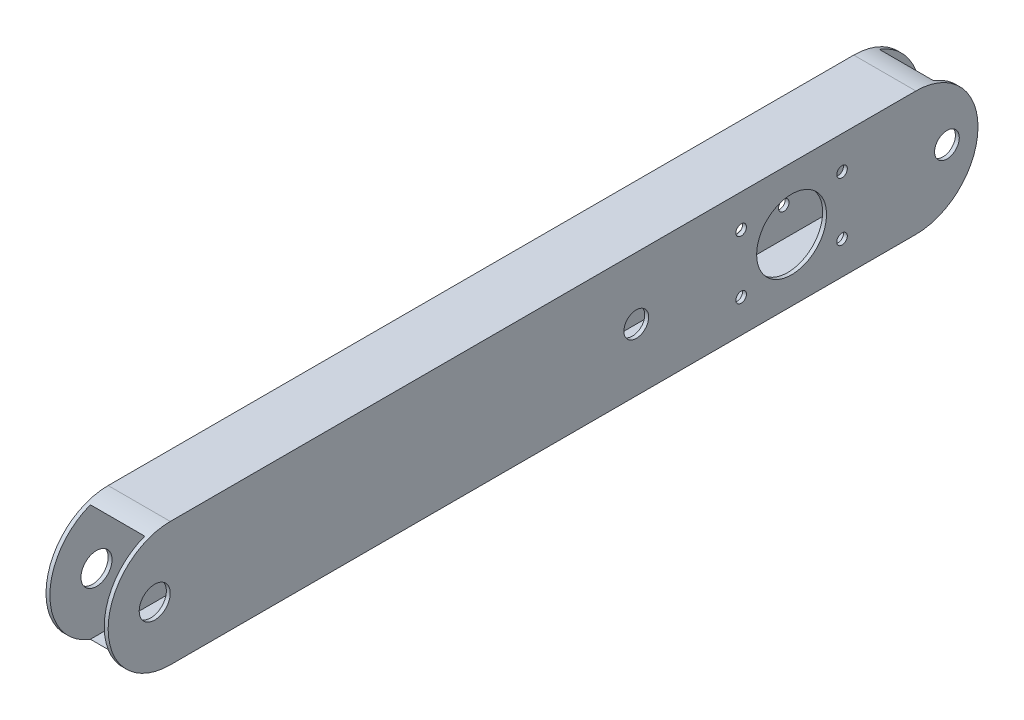
ISO-10303-21;
HEADER;
FILE_DESCRIPTION(('STEP AP214'),'2;1');
FILE_NAME('part.step','',(''),(''),'','','');
FILE_SCHEMA(('AUTOMOTIVE_DESIGN { 1 0 10303 214 1 1 1 1 }'));
ENDSEC;
DATA;
#1=APPLICATION_CONTEXT('core data for automotive mechanical design processes');
#2=APPLICATION_PROTOCOL_DEFINITION('international standard','automotive_design',2000,#1);
#3=PRODUCT_CONTEXT('',#1,'mechanical');
#4=PRODUCT('Part','Part','',(#3));
#5=PRODUCT_RELATED_PRODUCT_CATEGORY('part','',(#4));
#6=PRODUCT_DEFINITION_FORMATION('','',#4);
#7=PRODUCT_DEFINITION_CONTEXT('part definition',#1,'design');
#8=PRODUCT_DEFINITION('design','',#6,#7);
#9=PRODUCT_DEFINITION_SHAPE('','',#8);
#10=(LENGTH_UNIT() NAMED_UNIT(*) SI_UNIT(.MILLI.,.METRE.));
#11=(NAMED_UNIT(*) PLANE_ANGLE_UNIT() SI_UNIT($,.RADIAN.));
#12=(NAMED_UNIT(*) SI_UNIT($,.STERADIAN.) SOLID_ANGLE_UNIT());
#13=UNCERTAINTY_MEASURE_WITH_UNIT(LENGTH_MEASURE(1.E-05),#10,'distance_accuracy_value','');
#14=(GEOMETRIC_REPRESENTATION_CONTEXT(3) GLOBAL_UNCERTAINTY_ASSIGNED_CONTEXT((#13)) GLOBAL_UNIT_ASSIGNED_CONTEXT((#10,
#11,#12)) REPRESENTATION_CONTEXT('',''));
#15=CARTESIAN_POINT('',(0.,0.,0.));
#16=DIRECTION('',(0.,0.,1.));
#17=DIRECTION('',(1.,0.,0.));
#18=AXIS2_PLACEMENT_3D('',#15,#16,#17);
#19=CARTESIAN_POINT('',(-12.7,0.,158.75));
#20=DIRECTION('',(-1.,0.,0.));
#21=DIRECTION('',(0.,0.,1.));
#22=AXIS2_PLACEMENT_3D('',#19,#20,#21);
#23=CYLINDRICAL_SURFACE('',#22,6.35);
#24=CARTESIAN_POINT('',(11.1125,0.,158.75));
#25=DIRECTION('',(-1.,0.,0.));
#26=DIRECTION('',(0.,0.,1.));
#27=AXIS2_PLACEMENT_3D('',#24,#25,#26);
#28=CIRCLE('',#27,6.35);
#29=CARTESIAN_POINT('',(11.1125,0.,165.1));
#30=VERTEX_POINT('',#29);
#31=EDGE_CURVE('E115',#30,#30,#28,.F.);
#32=ORIENTED_EDGE('',*,*,#31,.F.);
#33=EDGE_LOOP('',(#32));
#34=FACE_BOUND('',#33,.T.);
#35=CARTESIAN_POINT('',(12.7,0.,158.75));
#36=DIRECTION('',(-1.,0.,0.));
#37=DIRECTION('',(0.,0.,1.));
#38=AXIS2_PLACEMENT_3D('',#35,#36,#37);
#39=CIRCLE('',#38,6.35);
#40=CARTESIAN_POINT('',(12.7,0.,165.1));
#41=VERTEX_POINT('',#40);
#42=EDGE_CURVE('E19',#41,#41,#39,.T.);
#43=ORIENTED_EDGE('',*,*,#42,.F.);
#44=EDGE_LOOP('',(#43));
#45=FACE_BOUND('',#44,.T.);
#46=ADVANCED_FACE('F16',(#34,#45),#23,.F.);
#47=CARTESIAN_POINT('',(12.7,0.,-38.1));
#48=DIRECTION('',(1.,0.,0.));
#49=DIRECTION('',(0.,0.,-1.));
#50=AXIS2_PLACEMENT_3D('',#47,#48,#49);
#51=CYLINDRICAL_SURFACE('',#50,5.0546);
#52=CARTESIAN_POINT('',(11.1125,0.,-38.1));
#53=DIRECTION('',(1.,0.,0.));
#54=DIRECTION('',(0.,0.,-1.));
#55=AXIS2_PLACEMENT_3D('',#52,#53,#54);
#56=CIRCLE('',#55,5.0546);
#57=CARTESIAN_POINT('',(11.1125,0.,-43.1546));
#58=VERTEX_POINT('',#57);
#59=EDGE_CURVE('E213',#58,#58,#56,.T.);
#60=ORIENTED_EDGE('',*,*,#59,.F.);
#61=EDGE_LOOP('',(#60));
#62=FACE_BOUND('',#61,.T.);
#63=CARTESIAN_POINT('',(12.7,0.,-38.1));
#64=DIRECTION('',(1.,0.,0.));
#65=DIRECTION('',(0.,0.,-1.));
#66=AXIS2_PLACEMENT_3D('',#63,#64,#65);
#67=CIRCLE('',#66,5.0546);
#68=CARTESIAN_POINT('',(12.7,0.,-43.1546));
#69=VERTEX_POINT('',#68);
#70=EDGE_CURVE('E234',#69,#69,#67,.F.);
#71=ORIENTED_EDGE('',*,*,#70,.F.);
#72=EDGE_LOOP('',(#71));
#73=FACE_BOUND('',#72,.T.);
#74=ADVANCED_FACE('F243',(#62,#73),#51,.F.);
#75=CARTESIAN_POINT('',(12.7,0.,-165.1));
#76=DIRECTION('',(1.,0.,0.));
#77=DIRECTION('',(0.,0.,-1.));
#78=AXIS2_PLACEMENT_3D('',#75,#76,#77);
#79=CYLINDRICAL_SURFACE('',#78,5.0546);
#80=CARTESIAN_POINT('',(11.1125,0.,-165.1));
#81=DIRECTION('',(1.,0.,0.));
#82=DIRECTION('',(0.,0.,-1.));
#83=AXIS2_PLACEMENT_3D('',#80,#81,#82);
#84=CIRCLE('',#83,5.0546);
#85=CARTESIAN_POINT('',(11.1125,0.,-170.1546));
#86=VERTEX_POINT('',#85);
#87=EDGE_CURVE('E210',#86,#86,#84,.T.);
#88=ORIENTED_EDGE('',*,*,#87,.F.);
#89=EDGE_LOOP('',(#88));
#90=FACE_BOUND('',#89,.T.);
#91=CARTESIAN_POINT('',(12.7,0.,-165.1));
#92=DIRECTION('',(1.,0.,0.));
#93=DIRECTION('',(0.,0.,-1.));
#94=AXIS2_PLACEMENT_3D('',#91,#92,#93);
#95=CIRCLE('',#94,5.0546);
#96=CARTESIAN_POINT('',(12.7,0.,-170.1546));
#97=VERTEX_POINT('',#96);
#98=EDGE_CURVE('E232',#97,#97,#95,.F.);
#99=ORIENTED_EDGE('',*,*,#98,.F.);
#100=EDGE_LOOP('',(#99));
#101=FACE_BOUND('',#100,.T.);
#102=ADVANCED_FACE('F249',(#90,#101),#79,.F.);
#103=CARTESIAN_POINT('',(12.7,-11.90625,-80.9777700723808));
#104=DIRECTION('',(1.,0.,0.));
#105=DIRECTION('',(0.,0.,-1.));
#106=AXIS2_PLACEMENT_3D('',#103,#104,#105);
#107=CYLINDRICAL_SURFACE('',#106,2.159);
#108=CARTESIAN_POINT('',(11.1125,-11.90625,-80.9777700723808));
#109=DIRECTION('',(1.,0.,0.));
#110=DIRECTION('',(0.,0.,-1.));
#111=AXIS2_PLACEMENT_3D('',#108,#109,#110);
#112=CIRCLE('',#111,2.159);
#113=CARTESIAN_POINT('',(11.1125,-11.90625,-83.1367700723808));
#114=VERTEX_POINT('',#113);
#115=EDGE_CURVE('E207',#114,#114,#112,.T.);
#116=ORIENTED_EDGE('',*,*,#115,.F.);
#117=EDGE_LOOP('',(#116));
#118=FACE_BOUND('',#117,.T.);
#119=CARTESIAN_POINT('',(12.7,-11.90625,-80.9777700723808));
#120=DIRECTION('',(1.,0.,0.));
#121=DIRECTION('',(0.,0.,-1.));
#122=AXIS2_PLACEMENT_3D('',#119,#120,#121);
#123=CIRCLE('',#122,2.159);
#124=CARTESIAN_POINT('',(12.7,-11.90625,-83.1367700723808));
#125=VERTEX_POINT('',#124);
#126=EDGE_CURVE('E229',#125,#125,#123,.F.);
#127=ORIENTED_EDGE('',*,*,#126,.F.);
#128=EDGE_LOOP('',(#127));
#129=FACE_BOUND('',#128,.T.);
#130=ADVANCED_FACE('F338',(#118,#129),#107,.F.);
#131=CARTESIAN_POINT('',(12.7,11.90625,-80.9777700723808));
#132=DIRECTION('',(1.,0.,0.));
#133=DIRECTION('',(0.,0.,-1.));
#134=AXIS2_PLACEMENT_3D('',#131,#132,#133);
#135=CYLINDRICAL_SURFACE('',#134,2.159);
#136=CARTESIAN_POINT('',(11.1125,11.90625,-80.9777700723808));
#137=DIRECTION('',(1.,0.,0.));
#138=DIRECTION('',(0.,0.,-1.));
#139=AXIS2_PLACEMENT_3D('',#136,#137,#138);
#140=CIRCLE('',#139,2.159);
#141=CARTESIAN_POINT('',(11.1125,11.90625,-83.1367700723808));
#142=VERTEX_POINT('',#141);
#143=EDGE_CURVE('E204',#142,#142,#140,.T.);
#144=ORIENTED_EDGE('',*,*,#143,.F.);
#145=EDGE_LOOP('',(#144));
#146=FACE_BOUND('',#145,.T.);
#147=CARTESIAN_POINT('',(12.7,11.90625,-80.9777700723808));
#148=DIRECTION('',(1.,0.,0.));
#149=DIRECTION('',(0.,0.,-1.));
#150=AXIS2_PLACEMENT_3D('',#147,#148,#149);
#151=CIRCLE('',#150,2.159);
#152=CARTESIAN_POINT('',(12.7,11.90625,-83.1367700723808));
#153=VERTEX_POINT('',#152);
#154=EDGE_CURVE('E226',#153,#153,#151,.F.);
#155=ORIENTED_EDGE('',*,*,#154,.F.);
#156=EDGE_LOOP('',(#155));
#157=FACE_BOUND('',#156,.T.);
#158=ADVANCED_FACE('F334',(#146,#157),#135,.F.);
#159=CARTESIAN_POINT('',(12.7,11.90625,-122.222229927619));
#160=DIRECTION('',(1.,0.,0.));
#161=DIRECTION('',(0.,0.,-1.));
#162=AXIS2_PLACEMENT_3D('',#159,#160,#161);
#163=CYLINDRICAL_SURFACE('',#162,2.159);
#164=CARTESIAN_POINT('',(11.1125,11.90625,-122.222229927619));
#165=DIRECTION('',(1.,0.,0.));
#166=DIRECTION('',(0.,0.,-1.));
#167=AXIS2_PLACEMENT_3D('',#164,#165,#166);
#168=CIRCLE('',#167,2.159);
#169=CARTESIAN_POINT('',(11.1125,11.90625,-124.381229927619));
#170=VERTEX_POINT('',#169);
#171=EDGE_CURVE('E201',#170,#170,#168,.T.);
#172=ORIENTED_EDGE('',*,*,#171,.F.);
#173=EDGE_LOOP('',(#172));
#174=FACE_BOUND('',#173,.T.);
#175=CARTESIAN_POINT('',(12.7,11.90625,-122.222229927619));
#176=DIRECTION('',(1.,0.,0.));
#177=DIRECTION('',(0.,0.,-1.));
#178=AXIS2_PLACEMENT_3D('',#175,#176,#177);
#179=CIRCLE('',#178,2.159);
#180=CARTESIAN_POINT('',(12.7,11.90625,-124.381229927619));
#181=VERTEX_POINT('',#180);
#182=EDGE_CURVE('E223',#181,#181,#179,.F.);
#183=ORIENTED_EDGE('',*,*,#182,.F.);
#184=EDGE_LOOP('',(#183));
#185=FACE_BOUND('',#184,.T.);
#186=ADVANCED_FACE('F330',(#174,#185),#163,.F.);
#187=CARTESIAN_POINT('',(12.7,-11.90625,-122.222229927619));
#188=DIRECTION('',(1.,0.,0.));
#189=DIRECTION('',(0.,0.,-1.));
#190=AXIS2_PLACEMENT_3D('',#187,#188,#189);
#191=CYLINDRICAL_SURFACE('',#190,2.159);
#192=CARTESIAN_POINT('',(11.1125,-11.90625,-122.222229927619));
#193=DIRECTION('',(1.,0.,0.));
#194=DIRECTION('',(0.,0.,-1.));
#195=AXIS2_PLACEMENT_3D('',#192,#193,#194);
#196=CIRCLE('',#195,2.159);
#197=CARTESIAN_POINT('',(11.1125,-11.90625,-124.381229927619));
#198=VERTEX_POINT('',#197);
#199=EDGE_CURVE('E198',#198,#198,#196,.T.);
#200=ORIENTED_EDGE('',*,*,#199,.F.);
#201=EDGE_LOOP('',(#200));
#202=FACE_BOUND('',#201,.T.);
#203=CARTESIAN_POINT('',(12.7,-11.90625,-122.222229927619));
#204=DIRECTION('',(1.,0.,0.));
#205=DIRECTION('',(0.,0.,-1.));
#206=AXIS2_PLACEMENT_3D('',#203,#204,#205);
#207=CIRCLE('',#206,2.159);
#208=CARTESIAN_POINT('',(12.7,-11.90625,-124.381229927619));
#209=VERTEX_POINT('',#208);
#210=EDGE_CURVE('E220',#209,#209,#207,.F.);
#211=ORIENTED_EDGE('',*,*,#210,.F.);
#212=EDGE_LOOP('',(#211));
#213=FACE_BOUND('',#212,.T.);
#214=ADVANCED_FACE('F326',(#202,#213),#191,.F.);
#215=CARTESIAN_POINT('',(-12.7,0.,-101.6));
#216=DIRECTION('',(-1.,0.,0.));
#217=DIRECTION('',(0.,0.,1.));
#218=AXIS2_PLACEMENT_3D('',#215,#216,#217);
#219=CYLINDRICAL_SURFACE('',#218,14.2875);
#220=CARTESIAN_POINT('',(11.1125,0.,-101.6));
#221=DIRECTION('',(-1.,0.,0.));
#222=DIRECTION('',(0.,0.,1.));
#223=AXIS2_PLACEMENT_3D('',#220,#221,#222);
#224=CIRCLE('',#223,14.2875);
#225=CARTESIAN_POINT('',(11.1125,0.,-87.3125));
#226=VERTEX_POINT('',#225);
#227=EDGE_CURVE('E111',#226,#226,#224,.F.);
#228=ORIENTED_EDGE('',*,*,#227,.F.);
#229=EDGE_LOOP('',(#228));
#230=FACE_BOUND('',#229,.T.);
#231=CARTESIAN_POINT('',(12.7,0.,-101.6));
#232=DIRECTION('',(-1.,0.,0.));
#233=DIRECTION('',(0.,0.,1.));
#234=AXIS2_PLACEMENT_3D('',#231,#232,#233);
#235=CIRCLE('',#234,14.2875);
#236=CARTESIAN_POINT('',(12.7,0.,-87.3125));
#237=VERTEX_POINT('',#236);
#238=EDGE_CURVE('E119',#237,#237,#235,.T.);
#239=ORIENTED_EDGE('',*,*,#238,.F.);
#240=EDGE_LOOP('',(#239));
#241=FACE_BOUND('',#240,.T.);
#242=ADVANCED_FACE('F322',(#230,#241),#219,.F.);
#243=CARTESIAN_POINT('',(12.7,-25.4,-177.8));
#244=DIRECTION('',(1.,0.,0.));
#245=DIRECTION('',(0.,0.,-1.));
#246=AXIS2_PLACEMENT_3D('',#243,#244,#245);
#247=PLANE('',#246);
#248=ORIENTED_EDGE('',*,*,#238,.T.);
#249=EDGE_LOOP('',(#248));
#250=FACE_BOUND('',#249,.T.);
#251=ORIENTED_EDGE('',*,*,#210,.T.);
#252=EDGE_LOOP('',(#251));
#253=FACE_BOUND('',#252,.T.);
#254=ORIENTED_EDGE('',*,*,#182,.T.);
#255=EDGE_LOOP('',(#254));
#256=FACE_BOUND('',#255,.T.);
#257=ORIENTED_EDGE('',*,*,#154,.T.);
#258=EDGE_LOOP('',(#257));
#259=FACE_BOUND('',#258,.T.);
#260=ORIENTED_EDGE('',*,*,#126,.T.);
#261=EDGE_LOOP('',(#260));
#262=FACE_BOUND('',#261,.T.);
#263=ORIENTED_EDGE('',*,*,#98,.T.);
#264=EDGE_LOOP('',(#263));
#265=FACE_BOUND('',#264,.T.);
#266=ORIENTED_EDGE('',*,*,#70,.T.);
#267=EDGE_LOOP('',(#266));
#268=FACE_BOUND('',#267,.T.);
#269=ORIENTED_EDGE('',*,*,#42,.T.);
#270=EDGE_LOOP('',(#269));
#271=FACE_BOUND('',#270,.T.);
#272=DIRECTION('',(0.,0.,-1.));
#273=VECTOR('',#272,1.);
#274=CARTESIAN_POINT('',(12.7,-25.4,-177.8));
#275=LINE('',#274,#273);
#276=CARTESIAN_POINT('',(12.7,-25.4,-152.4));
#277=VERTEX_POINT('',#276);
#278=CARTESIAN_POINT('',(12.7,-25.4,152.4));
#279=VERTEX_POINT('',#278);
#280=EDGE_CURVE('E77',#277,#279,#275,.F.);
#281=ORIENTED_EDGE('',*,*,#280,.F.);
#282=CARTESIAN_POINT('',(12.7,0.,-152.4));
#283=DIRECTION('',(1.,0.,0.));
#284=DIRECTION('',(0.,0.,-1.));
#285=AXIS2_PLACEMENT_3D('',#282,#283,#284);
#286=CIRCLE('',#285,25.4);
#287=CARTESIAN_POINT('',(12.7,25.4,-152.4));
#288=VERTEX_POINT('',#287);
#289=EDGE_CURVE('E190',#288,#277,#286,.F.);
#290=ORIENTED_EDGE('',*,*,#289,.F.);
#291=DIRECTION('',(0.,0.,1.));
#292=VECTOR('',#291,1.);
#293=CARTESIAN_POINT('',(12.7,25.4,-177.8));
#294=LINE('',#293,#292);
#295=CARTESIAN_POINT('',(12.7,25.4,152.4));
#296=VERTEX_POINT('',#295);
#297=EDGE_CURVE('E94',#296,#288,#294,.F.);
#298=ORIENTED_EDGE('',*,*,#297,.F.);
#299=CARTESIAN_POINT('',(12.7,0.,152.4));
#300=DIRECTION('',(1.,0.,0.));
#301=DIRECTION('',(0.,0.,-1.));
#302=AXIS2_PLACEMENT_3D('',#299,#300,#301);
#303=CIRCLE('',#302,25.4);
#304=EDGE_CURVE('E92',#279,#296,#303,.F.);
#305=ORIENTED_EDGE('',*,*,#304,.F.);
#306=EDGE_LOOP('',(#281,#290,#298,#305));
#307=FACE_BOUND('',#306,.T.);
#308=ADVANCED_FACE('F93',(#250,#253,#256,#259,#262,#265,#268,#271,#307),#247,.T.);
#309=CARTESIAN_POINT('',(-11.1125,23.8125,-177.8));
#310=DIRECTION('',(0.,-1.,0.));
#311=DIRECTION('',(0.,0.,-1.));
#312=AXIS2_PLACEMENT_3D('',#309,#310,#311);
#313=PLANE('',#312);
#314=DIRECTION('',(0.,0.,-1.));
#315=VECTOR('',#314,1.);
#316=CARTESIAN_POINT('',(-11.1125,23.8125,-177.8));
#317=LINE('',#316,#315);
#318=CARTESIAN_POINT('',(-11.1125,23.8124999999995,-161.238825925994));
#319=VERTEX_POINT('',#318);
#320=CARTESIAN_POINT('',(-11.1125,23.8124999999995,161.238825925994));
#321=VERTEX_POINT('',#320);
#322=EDGE_CURVE('E109',#319,#321,#317,.F.);
#323=ORIENTED_EDGE('',*,*,#322,.F.);
#324=DIRECTION('',(1.,0.,0.));
#325=VECTOR('',#324,1.);
#326=CARTESIAN_POINT('',(-45.81144,23.812499999999,-161.238825925995));
#327=LINE('',#326,#325);
#328=CARTESIAN_POINT('',(11.1125,23.8124999999995,-161.238825925994));
#329=VERTEX_POINT('',#328);
#330=EDGE_CURVE('E125',#329,#319,#327,.F.);
#331=ORIENTED_EDGE('',*,*,#330,.F.);
#332=DIRECTION('',(0.,0.,1.));
#333=VECTOR('',#332,1.);
#334=CARTESIAN_POINT('',(11.1125,23.8125,-177.8));
#335=LINE('',#334,#333);
#336=CARTESIAN_POINT('',(11.1125,23.8124999999995,161.238825925994));
#337=VERTEX_POINT('',#336);
#338=EDGE_CURVE('E112',#337,#329,#335,.F.);
#339=ORIENTED_EDGE('',*,*,#338,.F.);
#340=DIRECTION('',(1.,0.,0.));
#341=VECTOR('',#340,1.);
#342=CARTESIAN_POINT('',(-45.81144,23.812499999999,161.238825925995));
#343=LINE('',#342,#341);
#344=EDGE_CURVE('E129',#321,#337,#343,.T.);
#345=ORIENTED_EDGE('',*,*,#344,.F.);
#346=EDGE_LOOP('',(#323,#331,#339,#345));
#347=FACE_BOUND('',#346,.T.);
#348=ADVANCED_FACE('F315',(#347),#313,.T.);
#349=CARTESIAN_POINT('',(11.1125,-23.8125,-177.8));
#350=DIRECTION('',(0.,1.,0.));
#351=DIRECTION('',(0.,0.,1.));
#352=AXIS2_PLACEMENT_3D('',#349,#350,#351);
#353=PLANE('',#352);
#354=DIRECTION('',(0.,0.,1.));
#355=VECTOR('',#354,1.);
#356=CARTESIAN_POINT('',(11.1125,-23.8125,-177.8));
#357=LINE('',#356,#355);
#358=CARTESIAN_POINT('',(11.1125,-23.8124999999995,-161.238825925994));
#359=VERTEX_POINT('',#358);
#360=CARTESIAN_POINT('',(11.1125,-23.8124999999995,161.238825925994));
#361=VERTEX_POINT('',#360);
#362=EDGE_CURVE('E116',#359,#361,#357,.T.);
#363=ORIENTED_EDGE('',*,*,#362,.F.);
#364=DIRECTION('',(1.,0.,0.));
#365=VECTOR('',#364,1.);
#366=CARTESIAN_POINT('',(-45.81144,-23.812499999999,-161.238825925995));
#367=LINE('',#366,#365);
#368=CARTESIAN_POINT('',(-11.1125,-23.8124999999995,-161.238825925994));
#369=VERTEX_POINT('',#368);
#370=EDGE_CURVE('E120',#369,#359,#367,.T.);
#371=ORIENTED_EDGE('',*,*,#370,.F.);
#372=DIRECTION('',(0.,0.,-1.));
#373=VECTOR('',#372,1.);
#374=CARTESIAN_POINT('',(-11.1125,-23.8125,-177.8));
#375=LINE('',#374,#373);
#376=CARTESIAN_POINT('',(-11.1125,-23.8124999999995,161.238825925994));
#377=VERTEX_POINT('',#376);
#378=EDGE_CURVE('E88',#377,#369,#375,.T.);
#379=ORIENTED_EDGE('',*,*,#378,.F.);
#380=DIRECTION('',(1.,0.,0.));
#381=VECTOR('',#380,1.);
#382=CARTESIAN_POINT('',(-45.81144,-23.812499999999,161.238825925995));
#383=LINE('',#382,#381);
#384=EDGE_CURVE('E97',#361,#377,#383,.F.);
#385=ORIENTED_EDGE('',*,*,#384,.F.);
#386=EDGE_LOOP('',(#363,#371,#379,#385));
#387=FACE_BOUND('',#386,.T.);
#388=ADVANCED_FACE('F311',(#387),#353,.T.);
#389=CARTESIAN_POINT('',(11.1125,23.8125,-177.8));
#390=DIRECTION('',(-1.,0.,0.));
#391=DIRECTION('',(0.,0.,1.));
#392=AXIS2_PLACEMENT_3D('',#389,#390,#391);
#393=PLANE('',#392);
#394=ORIENTED_EDGE('',*,*,#227,.T.);
#395=EDGE_LOOP('',(#394));
#396=FACE_BOUND('',#395,.T.);
#397=ORIENTED_EDGE('',*,*,#199,.T.);
#398=EDGE_LOOP('',(#397));
#399=FACE_BOUND('',#398,.T.);
#400=ORIENTED_EDGE('',*,*,#171,.T.);
#401=EDGE_LOOP('',(#400));
#402=FACE_BOUND('',#401,.T.);
#403=ORIENTED_EDGE('',*,*,#143,.T.);
#404=EDGE_LOOP('',(#403));
#405=FACE_BOUND('',#404,.T.);
#406=ORIENTED_EDGE('',*,*,#115,.T.);
#407=EDGE_LOOP('',(#406));
#408=FACE_BOUND('',#407,.T.);
#409=ORIENTED_EDGE('',*,*,#87,.T.);
#410=EDGE_LOOP('',(#409));
#411=FACE_BOUND('',#410,.T.);
#412=ORIENTED_EDGE('',*,*,#59,.T.);
#413=EDGE_LOOP('',(#412));
#414=FACE_BOUND('',#413,.T.);
#415=ORIENTED_EDGE('',*,*,#31,.T.);
#416=EDGE_LOOP('',(#415));
#417=FACE_BOUND('',#416,.T.);
#418=ORIENTED_EDGE('',*,*,#338,.T.);
#419=CARTESIAN_POINT('',(11.1125,0.,-152.4));
#420=DIRECTION('',(1.,0.,0.));
#421=DIRECTION('',(0.,0.,-1.));
#422=AXIS2_PLACEMENT_3D('',#419,#420,#421);
#423=CIRCLE('',#422,25.4);
#424=EDGE_CURVE('E123',#359,#329,#423,.T.);
#425=ORIENTED_EDGE('',*,*,#424,.F.);
#426=ORIENTED_EDGE('',*,*,#362,.T.);
#427=CARTESIAN_POINT('',(11.1125,0.,152.4));
#428=DIRECTION('',(1.,0.,0.));
#429=DIRECTION('',(0.,0.,-1.));
#430=AXIS2_PLACEMENT_3D('',#427,#428,#429);
#431=CIRCLE('',#430,25.4);
#432=EDGE_CURVE('E132',#337,#361,#431,.T.);
#433=ORIENTED_EDGE('',*,*,#432,.F.);
#434=EDGE_LOOP('',(#418,#425,#426,#433));
#435=FACE_BOUND('',#434,.T.);
#436=ADVANCED_FACE('F307',(#396,#399,#402,#405,#408,#411,#414,#417,#435),#393,.T.);
#437=CARTESIAN_POINT('',(-11.1125,-23.8125,-177.8));
#438=DIRECTION('',(1.,0.,0.));
#439=DIRECTION('',(0.,0.,-1.));
#440=AXIS2_PLACEMENT_3D('',#437,#438,#439);
#441=PLANE('',#440);
#442=CARTESIAN_POINT('',(-11.1125,0.,-101.6));
#443=DIRECTION('',(-1.,0.,0.));
#444=DIRECTION('',(0.,0.,1.));
#445=AXIS2_PLACEMENT_3D('',#442,#443,#444);
#446=CIRCLE('',#445,14.2875);
#447=CARTESIAN_POINT('',(-11.1125,0.,-87.3125));
#448=VERTEX_POINT('',#447);
#449=EDGE_CURVE('E162',#448,#448,#446,.T.);
#450=ORIENTED_EDGE('',*,*,#449,.T.);
#451=EDGE_LOOP('',(#450));
#452=FACE_BOUND('',#451,.T.);
#453=CARTESIAN_POINT('',(-11.1125,-11.90625,-122.222229927619));
#454=DIRECTION('',(1.,0.,0.));
#455=DIRECTION('',(0.,0.,-1.));
#456=AXIS2_PLACEMENT_3D('',#453,#454,#455);
#457=CIRCLE('',#456,2.159);
#458=CARTESIAN_POINT('',(-11.1125,-11.90625,-124.381229927619));
#459=VERTEX_POINT('',#458);
#460=EDGE_CURVE('E165',#459,#459,#457,.F.);
#461=ORIENTED_EDGE('',*,*,#460,.T.);
#462=EDGE_LOOP('',(#461));
#463=FACE_BOUND('',#462,.T.);
#464=CARTESIAN_POINT('',(-11.1125,11.90625,-122.222229927619));
#465=DIRECTION('',(1.,0.,0.));
#466=DIRECTION('',(0.,0.,-1.));
#467=AXIS2_PLACEMENT_3D('',#464,#465,#466);
#468=CIRCLE('',#467,2.159);
#469=CARTESIAN_POINT('',(-11.1125,11.90625,-124.381229927619));
#470=VERTEX_POINT('',#469);
#471=EDGE_CURVE('E168',#470,#470,#468,.F.);
#472=ORIENTED_EDGE('',*,*,#471,.T.);
#473=EDGE_LOOP('',(#472));
#474=FACE_BOUND('',#473,.T.);
#475=CARTESIAN_POINT('',(-11.1125,11.90625,-80.9777700723808));
#476=DIRECTION('',(1.,0.,0.));
#477=DIRECTION('',(0.,0.,-1.));
#478=AXIS2_PLACEMENT_3D('',#475,#476,#477);
#479=CIRCLE('',#478,2.159);
#480=CARTESIAN_POINT('',(-11.1125,11.90625,-83.1367700723808));
#481=VERTEX_POINT('',#480);
#482=EDGE_CURVE('E171',#481,#481,#479,.F.);
#483=ORIENTED_EDGE('',*,*,#482,.T.);
#484=EDGE_LOOP('',(#483));
#485=FACE_BOUND('',#484,.T.);
#486=CARTESIAN_POINT('',(-11.1125,-11.90625,-80.9777700723808));
#487=DIRECTION('',(1.,0.,0.));
#488=DIRECTION('',(0.,0.,-1.));
#489=AXIS2_PLACEMENT_3D('',#486,#487,#488);
#490=CIRCLE('',#489,2.159);
#491=CARTESIAN_POINT('',(-11.1125,-11.90625,-83.1367700723808));
#492=VERTEX_POINT('',#491);
#493=EDGE_CURVE('E174',#492,#492,#490,.F.);
#494=ORIENTED_EDGE('',*,*,#493,.T.);
#495=EDGE_LOOP('',(#494));
#496=FACE_BOUND('',#495,.T.);
#497=CARTESIAN_POINT('',(-11.1125,0.,-165.1));
#498=DIRECTION('',(1.,0.,0.));
#499=DIRECTION('',(0.,0.,-1.));
#500=AXIS2_PLACEMENT_3D('',#497,#498,#499);
#501=CIRCLE('',#500,5.0546);
#502=CARTESIAN_POINT('',(-11.1125,0.,-170.1546));
#503=VERTEX_POINT('',#502);
#504=EDGE_CURVE('E177',#503,#503,#501,.F.);
#505=ORIENTED_EDGE('',*,*,#504,.T.);
#506=EDGE_LOOP('',(#505));
#507=FACE_BOUND('',#506,.T.);
#508=CARTESIAN_POINT('',(-11.1125,0.,-38.1));
#509=DIRECTION('',(1.,0.,0.));
#510=DIRECTION('',(0.,0.,-1.));
#511=AXIS2_PLACEMENT_3D('',#508,#509,#510);
#512=CIRCLE('',#511,5.0546);
#513=CARTESIAN_POINT('',(-11.1125,0.,-43.1546));
#514=VERTEX_POINT('',#513);
#515=EDGE_CURVE('E180',#514,#514,#512,.F.);
#516=ORIENTED_EDGE('',*,*,#515,.T.);
#517=EDGE_LOOP('',(#516));
#518=FACE_BOUND('',#517,.T.);
#519=CARTESIAN_POINT('',(-11.1125,0.,158.75));
#520=DIRECTION('',(-1.,0.,0.));
#521=DIRECTION('',(0.,0.,1.));
#522=AXIS2_PLACEMENT_3D('',#519,#520,#521);
#523=CIRCLE('',#522,6.35);
#524=CARTESIAN_POINT('',(-11.1125,0.,165.1));
#525=VERTEX_POINT('',#524);
#526=EDGE_CURVE('E183',#525,#525,#523,.T.);
#527=ORIENTED_EDGE('',*,*,#526,.T.);
#528=EDGE_LOOP('',(#527));
#529=FACE_BOUND('',#528,.T.);
#530=ORIENTED_EDGE('',*,*,#378,.T.);
#531=CARTESIAN_POINT('',(-11.1125,0.,-152.4));
#532=DIRECTION('',(1.,0.,0.));
#533=DIRECTION('',(0.,0.,-1.));
#534=AXIS2_PLACEMENT_3D('',#531,#532,#533);
#535=CIRCLE('',#534,25.4);
#536=EDGE_CURVE('E124',#319,#369,#535,.F.);
#537=ORIENTED_EDGE('',*,*,#536,.F.);
#538=ORIENTED_EDGE('',*,*,#322,.T.);
#539=CARTESIAN_POINT('',(-11.1125,0.,152.4));
#540=DIRECTION('',(1.,0.,0.));
#541=DIRECTION('',(0.,0.,-1.));
#542=AXIS2_PLACEMENT_3D('',#539,#540,#541);
#543=CIRCLE('',#542,25.4);
#544=EDGE_CURVE('E133',#377,#321,#543,.F.);
#545=ORIENTED_EDGE('',*,*,#544,.F.);
#546=EDGE_LOOP('',(#530,#537,#538,#545));
#547=FACE_BOUND('',#546,.T.);
#548=ADVANCED_FACE('F304',(#452,#463,#474,#485,#496,#507,#518,#529,#547),#441,.T.);
#549=CARTESIAN_POINT('',(-12.7,-25.4,-177.8));
#550=DIRECTION('',(0.,-1.,0.));
#551=DIRECTION('',(0.,0.,-1.));
#552=AXIS2_PLACEMENT_3D('',#549,#550,#551);
#553=PLANE('',#552);
#554=DIRECTION('',(0.,0.,1.));
#555=VECTOR('',#554,1.);
#556=CARTESIAN_POINT('',(-12.7,-25.4,-177.8));
#557=LINE('',#556,#555);
#558=CARTESIAN_POINT('',(-12.7,-25.4,-152.4));
#559=VERTEX_POINT('',#558);
#560=CARTESIAN_POINT('',(-12.7,-25.4,152.4));
#561=VERTEX_POINT('',#560);
#562=EDGE_CURVE('E161',#559,#561,#557,.T.);
#563=ORIENTED_EDGE('',*,*,#562,.F.);
#564=DIRECTION('',(1.,0.,0.));
#565=VECTOR('',#564,1.);
#566=CARTESIAN_POINT('',(-45.81144,-25.4,-152.4));
#567=LINE('',#566,#565);
#568=EDGE_CURVE('E84',#277,#559,#567,.F.);
#569=ORIENTED_EDGE('',*,*,#568,.F.);
#570=ORIENTED_EDGE('',*,*,#280,.T.);
#571=DIRECTION('',(1.,0.,0.));
#572=VECTOR('',#571,1.);
#573=CARTESIAN_POINT('',(-45.81144,-25.4,152.4));
#574=LINE('',#573,#572);
#575=EDGE_CURVE('E81',#561,#279,#574,.T.);
#576=ORIENTED_EDGE('',*,*,#575,.F.);
#577=EDGE_LOOP('',(#563,#569,#570,#576));
#578=FACE_BOUND('',#577,.T.);
#579=ADVANCED_FACE('F79',(#578),#553,.T.);
#580=CARTESIAN_POINT('',(-45.81144,0.,152.4));
#581=DIRECTION('',(1.,0.,0.));
#582=DIRECTION('',(0.,0.,-1.));
#583=AXIS2_PLACEMENT_3D('',#580,#581,#582);
#584=CYLINDRICAL_SURFACE('',#583,25.4);
#585=ORIENTED_EDGE('',*,*,#344,.T.);
#586=ORIENTED_EDGE('',*,*,#432,.T.);
#587=ORIENTED_EDGE('',*,*,#384,.T.);
#588=ORIENTED_EDGE('',*,*,#544,.T.);
#589=EDGE_LOOP('',(#585,#586,#587,#588));
#590=FACE_BOUND('',#589,.T.);
#591=ORIENTED_EDGE('',*,*,#304,.T.);
#592=DIRECTION('',(1.,0.,0.));
#593=VECTOR('',#592,1.);
#594=CARTESIAN_POINT('',(12.7,25.4,152.4));
#595=LINE('',#594,#593);
#596=CARTESIAN_POINT('',(-12.7,25.4,152.4));
#597=VERTEX_POINT('',#596);
#598=EDGE_CURVE('E106',#597,#296,#595,.T.);
#599=ORIENTED_EDGE('',*,*,#598,.F.);
#600=CARTESIAN_POINT('',(-12.7,0.,152.4));
#601=DIRECTION('',(1.,0.,0.));
#602=DIRECTION('',(0.,0.,-1.));
#603=AXIS2_PLACEMENT_3D('',#600,#601,#602);
#604=CIRCLE('',#603,25.4);
#605=EDGE_CURVE('E101',#561,#597,#604,.F.);
#606=ORIENTED_EDGE('',*,*,#605,.F.);
#607=ORIENTED_EDGE('',*,*,#575,.T.);
#608=EDGE_LOOP('',(#591,#599,#606,#607));
#609=FACE_BOUND('',#608,.T.);
#610=ADVANCED_FACE('F99',(#590,#609),#584,.T.);
#611=CARTESIAN_POINT('',(12.7,25.4,-177.8));
#612=DIRECTION('',(0.,1.,0.));
#613=DIRECTION('',(0.,0.,1.));
#614=AXIS2_PLACEMENT_3D('',#611,#612,#613);
#615=PLANE('',#614);
#616=ORIENTED_EDGE('',*,*,#297,.T.);
#617=DIRECTION('',(1.,0.,0.));
#618=VECTOR('',#617,1.);
#619=CARTESIAN_POINT('',(-45.81144,25.4,-152.4));
#620=LINE('',#619,#618);
#621=CARTESIAN_POINT('',(-12.7,25.4,-152.4));
#622=VERTEX_POINT('',#621);
#623=EDGE_CURVE('E34',#622,#288,#620,.T.);
#624=ORIENTED_EDGE('',*,*,#623,.F.);
#625=DIRECTION('',(0.,0.,1.));
#626=VECTOR('',#625,1.);
#627=CARTESIAN_POINT('',(-12.7,25.4,-177.8));
#628=LINE('',#627,#626);
#629=EDGE_CURVE('E159',#597,#622,#628,.F.);
#630=ORIENTED_EDGE('',*,*,#629,.F.);
#631=ORIENTED_EDGE('',*,*,#598,.T.);
#632=EDGE_LOOP('',(#616,#624,#630,#631));
#633=FACE_BOUND('',#632,.T.);
#634=ADVANCED_FACE('F295',(#633),#615,.T.);
#635=CARTESIAN_POINT('',(-45.81144,0.,-152.4));
#636=DIRECTION('',(1.,0.,0.));
#637=DIRECTION('',(0.,0.,-1.));
#638=AXIS2_PLACEMENT_3D('',#635,#636,#637);
#639=CYLINDRICAL_SURFACE('',#638,25.4);
#640=ORIENTED_EDGE('',*,*,#370,.T.);
#641=ORIENTED_EDGE('',*,*,#424,.T.);
#642=ORIENTED_EDGE('',*,*,#330,.T.);
#643=ORIENTED_EDGE('',*,*,#536,.T.);
#644=EDGE_LOOP('',(#640,#641,#642,#643));
#645=FACE_BOUND('',#644,.T.);
#646=ORIENTED_EDGE('',*,*,#289,.T.);
#647=ORIENTED_EDGE('',*,*,#568,.T.);
#648=CARTESIAN_POINT('',(-12.7,0.,-152.4));
#649=DIRECTION('',(1.,0.,0.));
#650=DIRECTION('',(0.,0.,-1.));
#651=AXIS2_PLACEMENT_3D('',#648,#649,#650);
#652=CIRCLE('',#651,25.4);
#653=EDGE_CURVE('E156',#622,#559,#652,.F.);
#654=ORIENTED_EDGE('',*,*,#653,.F.);
#655=ORIENTED_EDGE('',*,*,#623,.T.);
#656=EDGE_LOOP('',(#646,#647,#654,#655));
#657=FACE_BOUND('',#656,.T.);
#658=ADVANCED_FACE('F291',(#645,#657),#639,.T.);
#659=CARTESIAN_POINT('',(-12.7,0.,158.75));
#660=DIRECTION('',(-1.,0.,0.));
#661=DIRECTION('',(0.,0.,1.));
#662=AXIS2_PLACEMENT_3D('',#659,#660,#661);
#663=CYLINDRICAL_SURFACE('',#662,6.35);
#664=ORIENTED_EDGE('',*,*,#526,.F.);
#665=EDGE_LOOP('',(#664));
#666=FACE_BOUND('',#665,.T.);
#667=CARTESIAN_POINT('',(-12.7,0.,158.75));
#668=DIRECTION('',(-1.,0.,0.));
#669=DIRECTION('',(0.,0.,1.));
#670=AXIS2_PLACEMENT_3D('',#667,#668,#669);
#671=CIRCLE('',#670,6.35);
#672=CARTESIAN_POINT('',(-12.7,0.,165.1));
#673=VERTEX_POINT('',#672);
#674=EDGE_CURVE('E153',#673,#673,#671,.F.);
#675=ORIENTED_EDGE('',*,*,#674,.F.);
#676=EDGE_LOOP('',(#675));
#677=FACE_BOUND('',#676,.T.);
#678=ADVANCED_FACE('F287',(#666,#677),#663,.F.);
#679=CARTESIAN_POINT('',(12.7,0.,-38.1));
#680=DIRECTION('',(1.,0.,0.));
#681=DIRECTION('',(0.,0.,-1.));
#682=AXIS2_PLACEMENT_3D('',#679,#680,#681);
#683=CYLINDRICAL_SURFACE('',#682,5.0546);
#684=ORIENTED_EDGE('',*,*,#515,.F.);
#685=EDGE_LOOP('',(#684));
#686=FACE_BOUND('',#685,.T.);
#687=CARTESIAN_POINT('',(-12.7,0.,-38.1));
#688=DIRECTION('',(1.,0.,0.));
#689=DIRECTION('',(0.,0.,-1.));
#690=AXIS2_PLACEMENT_3D('',#687,#688,#689);
#691=CIRCLE('',#690,5.0546);
#692=CARTESIAN_POINT('',(-12.7,0.,-43.1546));
#693=VERTEX_POINT('',#692);
#694=EDGE_CURVE('E150',#693,#693,#691,.T.);
#695=ORIENTED_EDGE('',*,*,#694,.F.);
#696=EDGE_LOOP('',(#695));
#697=FACE_BOUND('',#696,.T.);
#698=ADVANCED_FACE('F283',(#686,#697),#683,.F.);
#699=CARTESIAN_POINT('',(12.7,0.,-165.1));
#700=DIRECTION('',(1.,0.,0.));
#701=DIRECTION('',(0.,0.,-1.));
#702=AXIS2_PLACEMENT_3D('',#699,#700,#701);
#703=CYLINDRICAL_SURFACE('',#702,5.0546);
#704=ORIENTED_EDGE('',*,*,#504,.F.);
#705=EDGE_LOOP('',(#704));
#706=FACE_BOUND('',#705,.T.);
#707=CARTESIAN_POINT('',(-12.7,0.,-165.1));
#708=DIRECTION('',(1.,0.,0.));
#709=DIRECTION('',(0.,0.,-1.));
#710=AXIS2_PLACEMENT_3D('',#707,#708,#709);
#711=CIRCLE('',#710,5.0546);
#712=CARTESIAN_POINT('',(-12.7,0.,-170.1546));
#713=VERTEX_POINT('',#712);
#714=EDGE_CURVE('E147',#713,#713,#711,.T.);
#715=ORIENTED_EDGE('',*,*,#714,.F.);
#716=EDGE_LOOP('',(#715));
#717=FACE_BOUND('',#716,.T.);
#718=ADVANCED_FACE('F279',(#706,#717),#703,.F.);
#719=CARTESIAN_POINT('',(12.7,-11.90625,-80.9777700723808));
#720=DIRECTION('',(1.,0.,0.));
#721=DIRECTION('',(0.,0.,-1.));
#722=AXIS2_PLACEMENT_3D('',#719,#720,#721);
#723=CYLINDRICAL_SURFACE('',#722,2.159);
#724=ORIENTED_EDGE('',*,*,#493,.F.);
#725=EDGE_LOOP('',(#724));
#726=FACE_BOUND('',#725,.T.);
#727=CARTESIAN_POINT('',(-12.7,-11.90625,-80.9777700723808));
#728=DIRECTION('',(1.,0.,0.));
#729=DIRECTION('',(0.,0.,-1.));
#730=AXIS2_PLACEMENT_3D('',#727,#728,#729);
#731=CIRCLE('',#730,2.159);
#732=CARTESIAN_POINT('',(-12.7,-11.90625,-83.1367700723808));
#733=VERTEX_POINT('',#732);
#734=EDGE_CURVE('E144',#733,#733,#731,.T.);
#735=ORIENTED_EDGE('',*,*,#734,.F.);
#736=EDGE_LOOP('',(#735));
#737=FACE_BOUND('',#736,.T.);
#738=ADVANCED_FACE('F275',(#726,#737),#723,.F.);
#739=CARTESIAN_POINT('',(12.7,11.90625,-80.9777700723808));
#740=DIRECTION('',(1.,0.,0.));
#741=DIRECTION('',(0.,0.,-1.));
#742=AXIS2_PLACEMENT_3D('',#739,#740,#741);
#743=CYLINDRICAL_SURFACE('',#742,2.159);
#744=ORIENTED_EDGE('',*,*,#482,.F.);
#745=EDGE_LOOP('',(#744));
#746=FACE_BOUND('',#745,.T.);
#747=CARTESIAN_POINT('',(-12.7,11.90625,-80.9777700723808));
#748=DIRECTION('',(1.,0.,0.));
#749=DIRECTION('',(0.,0.,-1.));
#750=AXIS2_PLACEMENT_3D('',#747,#748,#749);
#751=CIRCLE('',#750,2.159);
#752=CARTESIAN_POINT('',(-12.7,11.90625,-83.1367700723808));
#753=VERTEX_POINT('',#752);
#754=EDGE_CURVE('E141',#753,#753,#751,.T.);
#755=ORIENTED_EDGE('',*,*,#754,.F.);
#756=EDGE_LOOP('',(#755));
#757=FACE_BOUND('',#756,.T.);
#758=ADVANCED_FACE('F271',(#746,#757),#743,.F.);
#759=CARTESIAN_POINT('',(12.7,11.90625,-122.222229927619));
#760=DIRECTION('',(1.,0.,0.));
#761=DIRECTION('',(0.,0.,-1.));
#762=AXIS2_PLACEMENT_3D('',#759,#760,#761);
#763=CYLINDRICAL_SURFACE('',#762,2.159);
#764=ORIENTED_EDGE('',*,*,#471,.F.);
#765=EDGE_LOOP('',(#764));
#766=FACE_BOUND('',#765,.T.);
#767=CARTESIAN_POINT('',(-12.7,11.90625,-122.222229927619));
#768=DIRECTION('',(1.,0.,0.));
#769=DIRECTION('',(0.,0.,-1.));
#770=AXIS2_PLACEMENT_3D('',#767,#768,#769);
#771=CIRCLE('',#770,2.159);
#772=CARTESIAN_POINT('',(-12.7,11.90625,-124.381229927619));
#773=VERTEX_POINT('',#772);
#774=EDGE_CURVE('E138',#773,#773,#771,.T.);
#775=ORIENTED_EDGE('',*,*,#774,.F.);
#776=EDGE_LOOP('',(#775));
#777=FACE_BOUND('',#776,.T.);
#778=ADVANCED_FACE('F267',(#766,#777),#763,.F.);
#779=CARTESIAN_POINT('',(12.7,-11.90625,-122.222229927619));
#780=DIRECTION('',(1.,0.,0.));
#781=DIRECTION('',(0.,0.,-1.));
#782=AXIS2_PLACEMENT_3D('',#779,#780,#781);
#783=CYLINDRICAL_SURFACE('',#782,2.159);
#784=ORIENTED_EDGE('',*,*,#460,.F.);
#785=EDGE_LOOP('',(#784));
#786=FACE_BOUND('',#785,.T.);
#787=CARTESIAN_POINT('',(-12.7,-11.90625,-122.222229927619));
#788=DIRECTION('',(1.,0.,0.));
#789=DIRECTION('',(0.,0.,-1.));
#790=AXIS2_PLACEMENT_3D('',#787,#788,#789);
#791=CIRCLE('',#790,2.159);
#792=CARTESIAN_POINT('',(-12.7,-11.90625,-124.381229927619));
#793=VERTEX_POINT('',#792);
#794=EDGE_CURVE('E25',#793,#793,#791,.T.);
#795=ORIENTED_EDGE('',*,*,#794,.F.);
#796=EDGE_LOOP('',(#795));
#797=FACE_BOUND('',#796,.T.);
#798=ADVANCED_FACE('F260',(#786,#797),#783,.F.);
#799=CARTESIAN_POINT('',(-12.7,0.,-101.6));
#800=DIRECTION('',(-1.,0.,0.));
#801=DIRECTION('',(0.,0.,1.));
#802=AXIS2_PLACEMENT_3D('',#799,#800,#801);
#803=CYLINDRICAL_SURFACE('',#802,14.2875);
#804=ORIENTED_EDGE('',*,*,#449,.F.);
#805=EDGE_LOOP('',(#804));
#806=FACE_BOUND('',#805,.T.);
#807=CARTESIAN_POINT('',(-12.7,0.,-101.6));
#808=DIRECTION('',(-1.,0.,0.));
#809=DIRECTION('',(0.,0.,1.));
#810=AXIS2_PLACEMENT_3D('',#807,#808,#809);
#811=CIRCLE('',#810,14.2875);
#812=CARTESIAN_POINT('',(-12.7,0.,-87.3125));
#813=VERTEX_POINT('',#812);
#814=EDGE_CURVE('E11',#813,#813,#811,.F.);
#815=ORIENTED_EDGE('',*,*,#814,.F.);
#816=EDGE_LOOP('',(#815));
#817=FACE_BOUND('',#816,.T.);
#818=ADVANCED_FACE('F254',(#806,#817),#803,.F.);
#819=CARTESIAN_POINT('',(-12.7,25.4,-177.8));
#820=DIRECTION('',(-1.,0.,0.));
#821=DIRECTION('',(0.,0.,1.));
#822=AXIS2_PLACEMENT_3D('',#819,#820,#821);
#823=PLANE('',#822);
#824=ORIENTED_EDGE('',*,*,#814,.T.);
#825=EDGE_LOOP('',(#824));
#826=FACE_BOUND('',#825,.T.);
#827=ORIENTED_EDGE('',*,*,#794,.T.);
#828=EDGE_LOOP('',(#827));
#829=FACE_BOUND('',#828,.T.);
#830=ORIENTED_EDGE('',*,*,#774,.T.);
#831=EDGE_LOOP('',(#830));
#832=FACE_BOUND('',#831,.T.);
#833=ORIENTED_EDGE('',*,*,#754,.T.);
#834=EDGE_LOOP('',(#833));
#835=FACE_BOUND('',#834,.T.);
#836=ORIENTED_EDGE('',*,*,#734,.T.);
#837=EDGE_LOOP('',(#836));
#838=FACE_BOUND('',#837,.T.);
#839=ORIENTED_EDGE('',*,*,#714,.T.);
#840=EDGE_LOOP('',(#839));
#841=FACE_BOUND('',#840,.T.);
#842=ORIENTED_EDGE('',*,*,#694,.T.);
#843=EDGE_LOOP('',(#842));
#844=FACE_BOUND('',#843,.T.);
#845=ORIENTED_EDGE('',*,*,#674,.T.);
#846=EDGE_LOOP('',(#845));
#847=FACE_BOUND('',#846,.T.);
#848=ORIENTED_EDGE('',*,*,#629,.T.);
#849=ORIENTED_EDGE('',*,*,#653,.T.);
#850=ORIENTED_EDGE('',*,*,#562,.T.);
#851=ORIENTED_EDGE('',*,*,#605,.T.);
#852=EDGE_LOOP('',(#848,#849,#850,#851));
#853=FACE_BOUND('',#852,.T.);
#854=ADVANCED_FACE('F252',(#826,#829,#832,#835,#838,#841,#844,#847,#853),#823,.T.);
#855=CLOSED_SHELL('',(#46,#74,#102,#130,#158,#186,#214,#242,#308,#348,#388,#436,#548,#579,#610,
#634,#658,#678,#698,#718,#738,#758,#778,#798,#818,#854));
#856=MANIFOLD_SOLID_BREP('B1',#855);
#857=ADVANCED_BREP_SHAPE_REPRESENTATION('',(#18,#856),#14);
#858=SHAPE_DEFINITION_REPRESENTATION(#9,#857);
ENDSEC;
END-ISO-10303-21;
